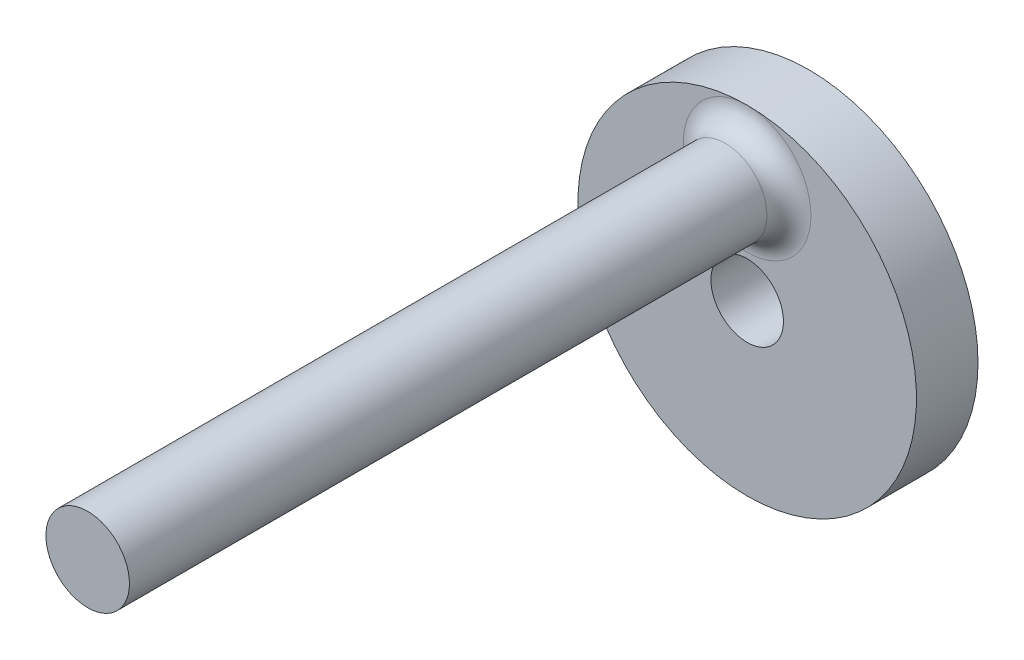
ISO-10303-21;
HEADER;
FILE_DESCRIPTION(('STEP AP214'),'2;1');
FILE_NAME('part.step','',(''),(''),'','','');
FILE_SCHEMA(('AUTOMOTIVE_DESIGN { 1 0 10303 214 1 1 1 1 }'));
ENDSEC;
DATA;
#1=APPLICATION_CONTEXT('core data for automotive mechanical design processes');
#2=APPLICATION_PROTOCOL_DEFINITION('international standard','automotive_design',2000,#1);
#3=PRODUCT_CONTEXT('',#1,'mechanical');
#4=PRODUCT('Part','Part','',(#3));
#5=PRODUCT_RELATED_PRODUCT_CATEGORY('part','',(#4));
#6=PRODUCT_DEFINITION_FORMATION('','',#4);
#7=PRODUCT_DEFINITION_CONTEXT('part definition',#1,'design');
#8=PRODUCT_DEFINITION('design','',#6,#7);
#9=PRODUCT_DEFINITION_SHAPE('','',#8);
#10=(LENGTH_UNIT() NAMED_UNIT(*) SI_UNIT(.MILLI.,.METRE.));
#11=(NAMED_UNIT(*) PLANE_ANGLE_UNIT() SI_UNIT($,.RADIAN.));
#12=(NAMED_UNIT(*) SI_UNIT($,.STERADIAN.) SOLID_ANGLE_UNIT());
#13=UNCERTAINTY_MEASURE_WITH_UNIT(LENGTH_MEASURE(1.E-05),#10,'distance_accuracy_value','');
#14=(GEOMETRIC_REPRESENTATION_CONTEXT(3) GLOBAL_UNCERTAINTY_ASSIGNED_CONTEXT((#13)) GLOBAL_UNIT_ASSIGNED_CONTEXT((#10,
#11,#12)) REPRESENTATION_CONTEXT('',''));
#15=CARTESIAN_POINT('',(0.,0.,0.));
#16=DIRECTION('',(0.,0.,1.));
#17=DIRECTION('',(1.,0.,0.));
#18=AXIS2_PLACEMENT_3D('',#15,#16,#17);
#19=CARTESIAN_POINT('',(0.,0.,2.8));
#20=DIRECTION('',(0.,0.,-1.));
#21=DIRECTION('',(-1.,0.,0.));
#22=AXIS2_PLACEMENT_3D('',#19,#20,#21);
#23=CYLINDRICAL_SURFACE('',#22,7.7);
#24=CARTESIAN_POINT('',(0.,0.,2.8));
#25=DIRECTION('',(0.,0.,1.));
#26=DIRECTION('',(1.,0.,0.));
#27=AXIS2_PLACEMENT_3D('',#24,#25,#26);
#28=CIRCLE('',#27,7.7);
#29=CARTESIAN_POINT('',(0.,7.7,2.8));
#30=VERTEX_POINT('',#29);
#31=EDGE_CURVE('E48',#30,#30,#28,.T.);
#32=ORIENTED_EDGE('',*,*,#31,.F.);
#33=EDGE_LOOP('',(#32));
#34=FACE_BOUND('',#33,.T.);
#35=CARTESIAN_POINT('',(0.,0.,0.));
#36=DIRECTION('',(0.,0.,1.));
#37=DIRECTION('',(1.,0.,0.));
#38=AXIS2_PLACEMENT_3D('',#35,#36,#37);
#39=CIRCLE('',#38,7.7);
#40=CARTESIAN_POINT('',(7.7,0.,0.));
#41=VERTEX_POINT('',#40);
#42=EDGE_CURVE('E50',#41,#41,#39,.T.);
#43=ORIENTED_EDGE('',*,*,#42,.T.);
#44=EDGE_LOOP('',(#43));
#45=FACE_BOUND('',#44,.T.);
#46=ADVANCED_FACE('F33',(#34,#45),#23,.T.);
#47=CARTESIAN_POINT('',(0.,0.,2.8));
#48=DIRECTION('',(0.,0.,1.));
#49=DIRECTION('',(1.,0.,0.));
#50=AXIS2_PLACEMENT_3D('',#47,#48,#49);
#51=PLANE('',#50);
#52=CARTESIAN_POINT('',(0.,0.,2.8));
#53=DIRECTION('',(0.,0.,1.));
#54=DIRECTION('',(1.,0.,0.));
#55=AXIS2_PLACEMENT_3D('',#52,#53,#54);
#56=CIRCLE('',#55,1.65);
#57=CARTESIAN_POINT('',(1.65,0.,2.8));
#58=VERTEX_POINT('',#57);
#59=EDGE_CURVE('E60',#58,#58,#56,.T.);
#60=ORIENTED_EDGE('',*,*,#59,.F.);
#61=EDGE_LOOP('',(#60));
#62=FACE_BOUND('',#61,.T.);
#63=ORIENTED_EDGE('',*,*,#31,.T.);
#64=CARTESIAN_POINT('',(0.,4.8,2.8));
#65=DIRECTION('',(0.,0.,1.));
#66=DIRECTION('',(1.,0.,0.));
#67=AXIS2_PLACEMENT_3D('',#64,#65,#66);
#68=CIRCLE('',#67,2.9);
#69=EDGE_CURVE('E11',#30,#30,#68,.F.);
#70=ORIENTED_EDGE('',*,*,#69,.T.);
#71=EDGE_LOOP('',(#63,#70));
#72=FACE_BOUND('',#71,.T.);
#73=ADVANCED_FACE('F46',(#62,#72),#51,.T.);
#74=CARTESIAN_POINT('',(0.,0.,0.));
#75=DIRECTION('',(0.,0.,1.));
#76=DIRECTION('',(1.,0.,0.));
#77=AXIS2_PLACEMENT_3D('',#74,#75,#76);
#78=PLANE('',#77);
#79=CARTESIAN_POINT('',(0.,0.,0.));
#80=DIRECTION('',(0.,0.,1.));
#81=DIRECTION('',(1.,0.,0.));
#82=AXIS2_PLACEMENT_3D('',#79,#80,#81);
#83=CIRCLE('',#82,1.65);
#84=CARTESIAN_POINT('',(1.65,0.,0.));
#85=VERTEX_POINT('',#84);
#86=EDGE_CURVE('E59',#85,#85,#83,.T.);
#87=ORIENTED_EDGE('',*,*,#86,.T.);
#88=EDGE_LOOP('',(#87));
#89=FACE_BOUND('',#88,.T.);
#90=ORIENTED_EDGE('',*,*,#42,.F.);
#91=EDGE_LOOP('',(#90));
#92=FACE_BOUND('',#91,.T.);
#93=ADVANCED_FACE('F66',(#89,#92),#78,.F.);
#94=CARTESIAN_POINT('',(0.,4.8,32.8));
#95=DIRECTION('',(0.,0.,-1.));
#96=DIRECTION('',(-1.,0.,0.));
#97=AXIS2_PLACEMENT_3D('',#94,#95,#96);
#98=CYLINDRICAL_SURFACE('',#97,1.9);
#99=CARTESIAN_POINT('',(0.,4.8,3.8));
#100=DIRECTION('',(0.,0.,1.));
#101=DIRECTION('',(1.,0.,0.));
#102=AXIS2_PLACEMENT_3D('',#99,#100,#101);
#103=CIRCLE('',#102,1.9);
#104=CARTESIAN_POINT('',(1.9,4.8,3.8));
#105=VERTEX_POINT('',#104);
#106=EDGE_CURVE('E40',#105,#105,#103,.T.);
#107=ORIENTED_EDGE('',*,*,#106,.T.);
#108=EDGE_LOOP('',(#107));
#109=FACE_BOUND('',#108,.T.);
#110=CARTESIAN_POINT('',(0.,4.8,32.8));
#111=DIRECTION('',(0.,0.,1.));
#112=DIRECTION('',(1.,0.,0.));
#113=AXIS2_PLACEMENT_3D('',#110,#111,#112);
#114=CIRCLE('',#113,1.9);
#115=CARTESIAN_POINT('',(1.9,4.8,32.8));
#116=VERTEX_POINT('',#115);
#117=EDGE_CURVE('E54',#116,#116,#114,.T.);
#118=ORIENTED_EDGE('',*,*,#117,.F.);
#119=EDGE_LOOP('',(#118));
#120=FACE_BOUND('',#119,.T.);
#121=ADVANCED_FACE('F82',(#109,#120),#98,.T.);
#122=CARTESIAN_POINT('',(0.,4.8,32.8));
#123=DIRECTION('',(0.,0.,1.));
#124=DIRECTION('',(1.,0.,0.));
#125=AXIS2_PLACEMENT_3D('',#122,#123,#124);
#126=PLANE('',#125);
#127=ORIENTED_EDGE('',*,*,#117,.T.);
#128=EDGE_LOOP('',(#127));
#129=FACE_BOUND('',#128,.T.);
#130=ADVANCED_FACE('F72',(#129),#126,.T.);
#131=CARTESIAN_POINT('',(0.,0.,0.));
#132=DIRECTION('',(0.,0.,1.));
#133=DIRECTION('',(1.,0.,0.));
#134=AXIS2_PLACEMENT_3D('',#131,#132,#133);
#135=CYLINDRICAL_SURFACE('',#134,1.65);
#136=ORIENTED_EDGE('',*,*,#86,.F.);
#137=EDGE_LOOP('',(#136));
#138=FACE_BOUND('',#137,.T.);
#139=ORIENTED_EDGE('',*,*,#59,.T.);
#140=EDGE_LOOP('',(#139));
#141=FACE_BOUND('',#140,.T.);
#142=ADVANCED_FACE('F69',(#138,#141),#135,.F.);
#143=CARTESIAN_POINT('',(0.,4.8,3.8));
#144=DIRECTION('',(0.,0.,1.));
#145=DIRECTION('',(1.,0.,0.));
#146=AXIS2_PLACEMENT_3D('',#143,#144,#145);
#147=TOROIDAL_SURFACE('',#146,2.9,1.);
#148=ORIENTED_EDGE('',*,*,#69,.F.);
#149=EDGE_LOOP('',(#148));
#150=FACE_BOUND('',#149,.T.);
#151=ORIENTED_EDGE('',*,*,#106,.F.);
#152=EDGE_LOOP('',(#151));
#153=FACE_BOUND('',#152,.T.);
#154=ADVANCED_FACE('F35',(#150,#153),#147,.F.);
#155=CLOSED_SHELL('',(#46,#73,#93,#121,#130,#142,#154));
#156=MANIFOLD_SOLID_BREP('B2',#155);
#157=ADVANCED_BREP_SHAPE_REPRESENTATION('',(#18,#156),#14);
#158=SHAPE_DEFINITION_REPRESENTATION(#9,#157);
ENDSEC;
END-ISO-10303-21;
